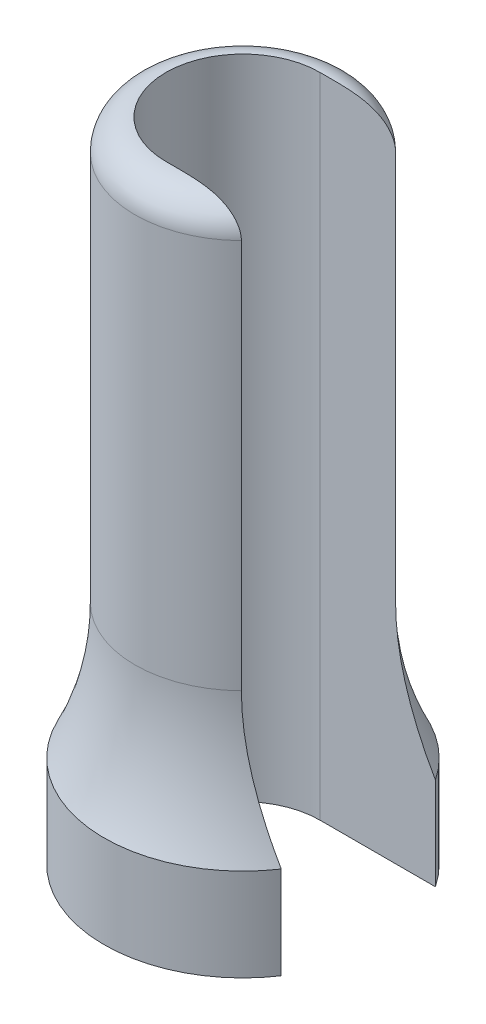
ISO-10303-21;
HEADER;
FILE_DESCRIPTION(('STEP AP214'),'2;1');
FILE_NAME('part.step','',(''),(''),'','','');
FILE_SCHEMA(('AUTOMOTIVE_DESIGN { 1 0 10303 214 1 1 1 1 }'));
ENDSEC;
DATA;
#1=APPLICATION_CONTEXT('core data for automotive mechanical design processes');
#2=APPLICATION_PROTOCOL_DEFINITION('international standard','automotive_design',2000,#1);
#3=PRODUCT_CONTEXT('',#1,'mechanical');
#4=PRODUCT('Part','Part','',(#3));
#5=PRODUCT_RELATED_PRODUCT_CATEGORY('part','',(#4));
#6=PRODUCT_DEFINITION_FORMATION('','',#4);
#7=PRODUCT_DEFINITION_CONTEXT('part definition',#1,'design');
#8=PRODUCT_DEFINITION('design','',#6,#7);
#9=PRODUCT_DEFINITION_SHAPE('','',#8);
#10=(LENGTH_UNIT() NAMED_UNIT(*) SI_UNIT(.MILLI.,.METRE.));
#11=(NAMED_UNIT(*) PLANE_ANGLE_UNIT() SI_UNIT($,.RADIAN.));
#12=(NAMED_UNIT(*) SI_UNIT($,.STERADIAN.) SOLID_ANGLE_UNIT());
#13=UNCERTAINTY_MEASURE_WITH_UNIT(LENGTH_MEASURE(1.E-05),#10,'distance_accuracy_value','');
#14=(GEOMETRIC_REPRESENTATION_CONTEXT(3) GLOBAL_UNCERTAINTY_ASSIGNED_CONTEXT((#13)) GLOBAL_UNIT_ASSIGNED_CONTEXT((#10,
#11,#12)) REPRESENTATION_CONTEXT('',''));
#15=CARTESIAN_POINT('',(0.,0.,0.));
#16=DIRECTION('',(0.,0.,1.));
#17=DIRECTION('',(1.,0.,0.));
#18=AXIS2_PLACEMENT_3D('',#15,#16,#17);
#19=CARTESIAN_POINT('',(0.,3.,0.));
#20=DIRECTION('',(0.,-1.,0.));
#21=DIRECTION('',(0.,0.,-1.));
#22=AXIS2_PLACEMENT_3D('',#19,#20,#21);
#23=CYLINDRICAL_SURFACE('',#22,4.5);
#24=CARTESIAN_POINT('',(0.,3.,0.));
#25=DIRECTION('',(0.,1.,0.));
#26=DIRECTION('',(0.,0.,1.));
#27=AXIS2_PLACEMENT_3D('',#24,#25,#26);
#28=CIRCLE('',#27,4.5);
#29=CARTESIAN_POINT('',(3.74165738677394,3.,-2.5));
#30=VERTEX_POINT('',#29);
#31=CARTESIAN_POINT('',(3.74165738677394,3.,2.5));
#32=VERTEX_POINT('',#31);
#33=EDGE_CURVE('E114',#30,#32,#28,.T.);
#34=ORIENTED_EDGE('',*,*,#33,.F.);
#35=DIRECTION('',(0.,1.,0.));
#36=VECTOR('',#35,1.);
#37=CARTESIAN_POINT('',(3.74165738677394,-16.5,-2.5));
#38=LINE('',#37,#36);
#39=CARTESIAN_POINT('',(3.74165738677394,0.,-2.5));
#40=VERTEX_POINT('',#39);
#41=EDGE_CURVE('E119',#40,#30,#38,.T.);
#42=ORIENTED_EDGE('',*,*,#41,.F.);
#43=CARTESIAN_POINT('',(0.,0.,0.));
#44=DIRECTION('',(0.,1.,0.));
#45=DIRECTION('',(0.,0.,1.));
#46=AXIS2_PLACEMENT_3D('',#43,#44,#45);
#47=CIRCLE('',#46,4.5);
#48=CARTESIAN_POINT('',(3.74165738677394,0.,2.5));
#49=VERTEX_POINT('',#48);
#50=EDGE_CURVE('E117',#40,#49,#47,.T.);
#51=ORIENTED_EDGE('',*,*,#50,.T.);
#52=DIRECTION('',(0.,1.,0.));
#53=VECTOR('',#52,1.);
#54=CARTESIAN_POINT('',(3.74165738677394,-16.5,2.5));
#55=LINE('',#54,#53);
#56=EDGE_CURVE('E100',#49,#32,#55,.T.);
#57=ORIENTED_EDGE('',*,*,#56,.T.);
#58=EDGE_LOOP('',(#34,#42,#51,#57));
#59=FACE_BOUND('',#58,.T.);
#60=ADVANCED_FACE('F39',(#59),#23,.T.);
#61=CARTESIAN_POINT('',(0.,0.,0.));
#62=DIRECTION('',(0.,1.,0.));
#63=DIRECTION('',(0.,0.,1.));
#64=AXIS2_PLACEMENT_3D('',#61,#62,#63);
#65=PLANE('',#64);
#66=ORIENTED_EDGE('',*,*,#50,.F.);
#67=DIRECTION('',(-1.,0.,0.));
#68=VECTOR('',#67,1.);
#69=CARTESIAN_POINT('',(0.,0.,-2.5));
#70=LINE('',#69,#68);
#71=CARTESIAN_POINT('',(0.,0.,-2.5));
#72=VERTEX_POINT('',#71);
#73=EDGE_CURVE('E192',#40,#72,#70,.T.);
#74=ORIENTED_EDGE('',*,*,#73,.T.);
#75=CARTESIAN_POINT('',(0.,0.,0.));
#76=DIRECTION('',(0.,1.,0.));
#77=DIRECTION('',(0.,0.,1.));
#78=AXIS2_PLACEMENT_3D('',#75,#76,#77);
#79=CIRCLE('',#78,2.5);
#80=CARTESIAN_POINT('',(0.,0.,2.5));
#81=VERTEX_POINT('',#80);
#82=EDGE_CURVE('E127',#72,#81,#79,.T.);
#83=ORIENTED_EDGE('',*,*,#82,.T.);
#84=DIRECTION('',(1.,0.,0.));
#85=VECTOR('',#84,1.);
#86=CARTESIAN_POINT('',(0.,0.,2.5));
#87=LINE('',#86,#85);
#88=EDGE_CURVE('E174',#81,#49,#87,.T.);
#89=ORIENTED_EDGE('',*,*,#88,.T.);
#90=EDGE_LOOP('',(#66,#74,#83,#89));
#91=FACE_BOUND('',#90,.T.);
#92=ADVANCED_FACE('F150',(#91),#65,.F.);
#93=CARTESIAN_POINT('',(0.,21.,0.));
#94=DIRECTION('',(0.,-1.,0.));
#95=DIRECTION('',(0.,0.,-1.));
#96=AXIS2_PLACEMENT_3D('',#93,#94,#95);
#97=CYLINDRICAL_SURFACE('',#96,3.5);
#98=DIRECTION('',(0.,1.,0.));
#99=VECTOR('',#98,1.);
#100=CARTESIAN_POINT('',(2.44948974278318,-1.50000000000001,2.5));
#101=LINE('',#100,#99);
#102=CARTESIAN_POINT('',(2.44948974278318,7.35889894354067,2.5));
#103=VERTEX_POINT('',#102);
#104=CARTESIAN_POINT('',(2.44948974278318,20.,2.5));
#105=VERTEX_POINT('',#104);
#106=EDGE_CURVE('E102',#103,#105,#101,.T.);
#107=ORIENTED_EDGE('',*,*,#106,.T.);
#108=CARTESIAN_POINT('',(0.,20.,0.));
#109=DIRECTION('',(0.,1.,0.));
#110=DIRECTION('',(0.,0.,1.));
#111=AXIS2_PLACEMENT_3D('',#108,#109,#110);
#112=CIRCLE('',#111,3.5);
#113=CARTESIAN_POINT('',(2.44948974278318,20.,-2.5));
#114=VERTEX_POINT('',#113);
#115=EDGE_CURVE('E54',#105,#114,#112,.F.);
#116=ORIENTED_EDGE('',*,*,#115,.T.);
#117=DIRECTION('',(0.,1.,0.));
#118=VECTOR('',#117,1.);
#119=CARTESIAN_POINT('',(2.44948974278318,-1.50000000000001,-2.5));
#120=LINE('',#119,#118);
#121=CARTESIAN_POINT('',(2.44948974278318,7.35889894354067,-2.5));
#122=VERTEX_POINT('',#121);
#123=EDGE_CURVE('E175',#122,#114,#120,.T.);
#124=ORIENTED_EDGE('',*,*,#123,.F.);
#125=CARTESIAN_POINT('',(0.,7.35889894354067,0.));
#126=DIRECTION('',(0.,-1.,0.));
#127=DIRECTION('',(0.,0.,-1.));
#128=AXIS2_PLACEMENT_3D('',#125,#126,#127);
#129=CIRCLE('',#128,3.5);
#130=EDGE_CURVE('E109',#122,#103,#129,.F.);
#131=ORIENTED_EDGE('',*,*,#130,.T.);
#132=EDGE_LOOP('',(#107,#116,#124,#131));
#133=FACE_BOUND('',#132,.T.);
#134=ADVANCED_FACE('F153',(#133),#97,.T.);
#135=CARTESIAN_POINT('',(0.,-1.50000000000001,0.));
#136=DIRECTION('',(0.,1.,0.));
#137=DIRECTION('',(0.,0.,1.));
#138=AXIS2_PLACEMENT_3D('',#135,#136,#137);
#139=CYLINDRICAL_SURFACE('',#138,2.5);
#140=DIRECTION('',(0.,1.,0.));
#141=VECTOR('',#140,1.);
#142=CARTESIAN_POINT('',(0.,-1.50000000000001,-2.5));
#143=LINE('',#142,#141);
#144=CARTESIAN_POINT('',(0.,21.,-2.5));
#145=VERTEX_POINT('',#144);
#146=EDGE_CURVE('E167',#72,#145,#143,.T.);
#147=ORIENTED_EDGE('',*,*,#146,.T.);
#148=CARTESIAN_POINT('',(0.,21.,0.));
#149=DIRECTION('',(0.,1.,0.));
#150=DIRECTION('',(0.,0.,1.));
#151=AXIS2_PLACEMENT_3D('',#148,#149,#150);
#152=CIRCLE('',#151,2.5);
#153=CARTESIAN_POINT('',(0.,21.,2.5));
#154=VERTEX_POINT('',#153);
#155=EDGE_CURVE('E170',#145,#154,#152,.T.);
#156=ORIENTED_EDGE('',*,*,#155,.T.);
#157=DIRECTION('',(0.,1.,0.));
#158=VECTOR('',#157,1.);
#159=CARTESIAN_POINT('',(0.,-1.50000000000001,2.5));
#160=LINE('',#159,#158);
#161=EDGE_CURVE('E180',#81,#154,#160,.T.);
#162=ORIENTED_EDGE('',*,*,#161,.F.);
#163=ORIENTED_EDGE('',*,*,#82,.F.);
#164=EDGE_LOOP('',(#147,#156,#162,#163));
#165=FACE_BOUND('',#164,.T.);
#166=ADVANCED_FACE('F156',(#165),#139,.F.);
#167=CARTESIAN_POINT('',(0.,-1.50000000000001,-2.5));
#168=DIRECTION('',(0.,0.,-1.));
#169=DIRECTION('',(-1.,0.,0.));
#170=AXIS2_PLACEMENT_3D('',#167,#168,#169);
#171=PLANE('',#170);
#172=ORIENTED_EDGE('',*,*,#123,.T.);
#173=CARTESIAN_POINT('',(2.44948974278318,20.,-2.5));
#174=CARTESIAN_POINT('',(2.44949248220905,20.0216892090072,-2.5));
#175=CARTESIAN_POINT('',(2.44848062898522,20.0433657922529,-2.5));
#176=CARTESIAN_POINT('',(2.44446408122315,20.0865215234319,-2.5));
#177=CARTESIAN_POINT('',(2.44146050999331,20.1080007757388,-2.5));
#178=CARTESIAN_POINT('',(2.4295775054387,20.1715864977788,-2.5));
#179=CARTESIAN_POINT('',(2.41782445998479,20.2131865400516,-2.5));
#180=CARTESIAN_POINT('',(2.38741443940528,20.2936312345789,-2.5));
#181=CARTESIAN_POINT('',(2.36877072236197,20.3324810085905,-2.5));
#182=CARTESIAN_POINT('',(2.3255808614028,20.4068043605177,-2.5));
#183=CARTESIAN_POINT('',(2.30102359281093,20.4422713970876,-2.5));
#184=CARTESIAN_POINT('',(2.238148396902,20.5204762775056,-2.5));
#185=CARTESIAN_POINT('',(2.19796918228049,20.5617158299715,-2.5));
#186=CARTESIAN_POINT('',(2.11154476631741,20.637080233287,-2.5));
#187=CARTESIAN_POINT('',(2.06529762936119,20.6712028048487,-2.5));
#188=CARTESIAN_POINT('',(1.94635522099902,20.7469659610157,-2.5));
#189=CARTESIAN_POINT('',(1.87127331282506,20.7848539757935,-2.5));
#190=CARTESIAN_POINT('',(1.75481054414618,20.8328296390386,-2.5));
#191=CARTESIAN_POINT('',(1.71512781636491,20.8473989674292,-2.5));
#192=CARTESIAN_POINT('',(1.63488793644295,20.8738253634689,-2.5));
#193=CARTESIAN_POINT('',(1.59433139759656,20.8856842696942,-2.5));
#194=CARTESIAN_POINT('',(1.4886106483483,20.913284790026,-2.5));
#195=CARTESIAN_POINT('',(1.42297877023962,20.9272182471442,-2.5));
#196=CARTESIAN_POINT('',(1.29086874269065,20.950346411328,-2.5));
#197=CARTESIAN_POINT('',(1.22438993855515,20.9595371917485,-2.5));
#198=CARTESIAN_POINT('',(1.09069536449658,20.9743564103371,-2.5));
#199=CARTESIAN_POINT('',(1.0234775550118,20.9799655839456,-2.5));
#200=CARTESIAN_POINT('',(0.888873054272358,20.9885942149464,-2.5));
#201=CARTESIAN_POINT('',(0.821486326340664,20.9916130501582,-2.5));
#202=CARTESIAN_POINT('',(0.690879450820612,20.9958354524013,-2.5));
#203=CARTESIAN_POINT('',(0.627662180007096,20.9971407011724,-2.5));
#204=CARTESIAN_POINT('',(0.501214463629527,20.9988956667328,-2.5));
#205=CARTESIAN_POINT('',(0.437984017520537,20.999345334843,-2.5));
#206=CARTESIAN_POINT('',(0.312289549729282,20.999871109872,-2.5));
#207=CARTESIAN_POINT('',(0.249825536948873,20.9999516829164,-2.5));
#208=CARTESIAN_POINT('',(0.12490760218445,20.9999991580207,-2.5));
#209=CARTESIAN_POINT('',(0.0624536802197722,20.9999660786568,-2.5));
#210=CARTESIAN_POINT('',(0.,21.,-2.5));
#211=B_SPLINE_CURVE_WITH_KNOTS('',3,(#173,#174,#175,#176,#177,#178,#179,#180,#181,#182,#183,
#184,#185,#186,#187,#188,#189,#190,#191,#192,#193,#194,#195,#196,#197,#198,#199,#200,#201,#202,
#203,#204,#205,#206,#207,#208,#209,#210),.UNSPECIFIED.,.F.,.F.,(4,2,2,2,2,2,2,2,2,2,2,2,2,2,2,2,
2,2,4),(0.,0.0650198175242697,0.130002995695699,0.258948214055522,0.387646614477254,
0.516589042412453,0.688363165076143,0.860192216022674,1.11099436083612,1.23775318494091,
1.36442576710924,1.56546896980062,1.76667835792791,1.96896108125938,2.17129237784551,
2.36097518172549,2.55066877745369,2.73806087139581,2.92542233801781),.UNSPECIFIED.);
#212=EDGE_CURVE('E11',#114,#145,#211,.T.);
#213=ORIENTED_EDGE('',*,*,#212,.T.);
#214=ORIENTED_EDGE('',*,*,#146,.F.);
#215=ORIENTED_EDGE('',*,*,#73,.F.);
#216=ORIENTED_EDGE('',*,*,#41,.T.);
#217=CARTESIAN_POINT('',(3.74165738677394,3.,-2.5));
#218=CARTESIAN_POINT('',(3.67409081945806,3.11600842094314,-2.5));
#219=CARTESIAN_POINT('',(3.60858487038733,3.23320438563919,-2.5));
#220=CARTESIAN_POINT('',(3.48188582578499,3.46993050984259,-2.5));
#221=CARTESIAN_POINT('',(3.42069349512446,3.58946107853668,-2.5));
#222=CARTESIAN_POINT('',(3.2436022260586,3.9520598094635,-2.5));
#223=CARTESIAN_POINT('',(3.1345433148397,4.1985298049304,-2.5));
#224=CARTESIAN_POINT('',(2.93964022013411,4.693207543722,-2.5));
#225=CARTESIAN_POINT('',(2.85327255607604,4.94120873915645,-2.5));
#226=CARTESIAN_POINT('',(2.70327086306637,5.44378411400527,-2.5));
#227=CARTESIAN_POINT('',(2.63960586070174,5.69834882604118,-2.5));
#228=CARTESIAN_POINT('',(2.56631487829308,6.07025711799183,-2.5));
#229=CARTESIAN_POINT('',(2.54627788202374,6.18560732485113,-2.5));
#230=CARTESIAN_POINT('',(2.51165728848184,6.4171236996476,-2.5));
#231=CARTESIAN_POINT('',(2.49707316415855,6.53328978761897,-2.5));
#232=CARTESIAN_POINT('',(2.47345563216244,6.76752248036587,-2.5));
#233=CARTESIAN_POINT('',(2.46448731463711,6.8855956646666,-2.5));
#234=CARTESIAN_POINT('',(2.45249469869331,7.1220766102168,-2.5));
#235=CARTESIAN_POINT('',(2.44947211161083,7.24048445797337,-2.5));
#236=CARTESIAN_POINT('',(2.44948974278319,7.35889894354067,-2.5));
#237=B_SPLINE_CURVE_WITH_KNOTS('',3,(#217,#218,#219,#220,#221,#222,#223,#224,#225,#226,#227,
#228,#229,#230,#231,#232,#233,#234,#235,#236),.UNSPECIFIED.,.F.,.F.,(4,2,2,2,2,2,2,2,2,4),(0.,
0.402705509808484,0.805482246831929,1.61313442705361,2.40008063607057,3.18594906331601,
3.53707723446336,3.88817145831942,4.2432631805694,4.5984570925145),.UNSPECIFIED.);
#238=EDGE_CURVE('E108',#30,#122,#237,.T.);
#239=ORIENTED_EDGE('',*,*,#238,.T.);
#240=EDGE_LOOP('',(#172,#213,#214,#215,#216,#239));
#241=FACE_BOUND('',#240,.T.);
#242=ADVANCED_FACE('F158',(#241),#171,.F.);
#243=CARTESIAN_POINT('',(0.,-1.50000000000001,2.5));
#244=DIRECTION('',(0.,0.,1.));
#245=DIRECTION('',(1.,0.,0.));
#246=AXIS2_PLACEMENT_3D('',#243,#244,#245);
#247=PLANE('',#246);
#248=ORIENTED_EDGE('',*,*,#161,.T.);
#249=CARTESIAN_POINT('',(0.,21.,2.5));
#250=CARTESIAN_POINT('',(0.0521330929069775,20.9999835367964,2.5));
#251=CARTESIAN_POINT('',(0.104266184271241,20.9999996393843,2.5));
#252=CARTESIAN_POINT('',(0.208535306013963,20.9999764734434,2.5));
#253=CARTESIAN_POINT('',(0.260671336390504,20.9999372017574,2.5));
#254=CARTESIAN_POINT('',(0.365144113196162,20.9996822690204,2.5));
#255=CARTESIAN_POINT('',(0.417480859377582,20.9994659292612,2.5));
#256=CARTESIAN_POINT('',(0.522150039780429,20.9986180154494,2.5));
#257=CARTESIAN_POINT('',(0.574482474067333,20.9979864497341,2.5));
#258=CARTESIAN_POINT('',(0.733338421109875,20.9949967208989,2.5));
#259=CARTESIAN_POINT('',(0.839846761536837,20.9915277451177,2.5));
#260=CARTESIAN_POINT('',(1.05238428897532,20.9783023988987,2.5));
#261=CARTESIAN_POINT('',(1.15841400137341,20.9685579442876,2.5));
#262=CARTESIAN_POINT('',(1.29999704033801,20.9483744360165,2.5));
#263=CARTESIAN_POINT('',(1.33620483485256,20.9425745324175,2.5));
#264=CARTESIAN_POINT('',(1.40836258634088,20.9295232136219,2.5));
#265=CARTESIAN_POINT('',(1.44431249638564,20.9222715408463,2.5));
#266=CARTESIAN_POINT('',(1.55150421720053,20.8980632081361,2.5));
#267=CARTESIAN_POINT('',(1.62222309808096,20.8786355632023,2.5));
#268=CARTESIAN_POINT('',(1.76162106150488,20.8312669912268,2.5));
#269=CARTESIAN_POINT('',(1.83027230857699,20.803242016256,2.5));
#270=CARTESIAN_POINT('',(1.96254949905858,20.7370075168595,2.5));
#271=CARTESIAN_POINT('',(2.02618316686525,20.6988140595612,2.5));
#272=CARTESIAN_POINT('',(2.12692292593058,20.6243457574792,2.5));
#273=CARTESIAN_POINT('',(2.1662057459586,20.5910293785925,2.5));
#274=CARTESIAN_POINT('',(2.23919109401747,20.5186765513192,2.5));
#275=CARTESIAN_POINT('',(2.27289421376143,20.4796407102959,2.5));
#276=CARTESIAN_POINT('',(2.33324025885503,20.3957022782932,2.5));
#277=CARTESIAN_POINT('',(2.35979892363659,20.3507382648771,2.5));
#278=CARTESIAN_POINT('',(2.40333945443153,20.2564192074598,2.5));
#279=CARTESIAN_POINT('',(2.42034692477148,20.2070763178443,2.5));
#280=CARTESIAN_POINT('',(2.43767653451683,20.1308863975793,2.5));
#281=CARTESIAN_POINT('',(2.44209094681293,20.1049220861027,2.5));
#282=CARTESIAN_POINT('',(2.44800171026533,20.052646217242,2.5));
#283=CARTESIAN_POINT('',(2.44949605967494,20.0263344340919,2.5));
#284=CARTESIAN_POINT('',(2.44948974278318,20.,2.5));
#285=B_SPLINE_CURVE_WITH_KNOTS('',3,(#249,#250,#251,#252,#253,#254,#255,#256,#257,#258,#259,
#260,#261,#262,#263,#264,#265,#266,#267,#268,#269,#270,#271,#272,#273,#274,#275,#276,#277,#278,
#279,#280,#281,#282,#283,#284),.UNSPECIFIED.,.F.,.F.,(4,2,2,2,2,2,2,2,2,2,2,2,2,2,2,2,2,4),(0.,
0.156399259273716,0.312807436498881,0.469817955168724,0.626825321366461,0.946460290502178,
1.265490121764,1.37547074023595,1.48547088923679,1.70506381656009,1.92687586535502,
2.14833948988548,2.30235315808563,2.45635048304864,2.6120914586792,2.76741291461382,
2.84627722258788,2.92519557428199),.UNSPECIFIED.);
#286=EDGE_CURVE('E68',#154,#105,#285,.T.);
#287=ORIENTED_EDGE('',*,*,#286,.T.);
#288=ORIENTED_EDGE('',*,*,#106,.F.);
#289=CARTESIAN_POINT('',(2.44948974278318,7.35889894354067,2.5));
#290=CARTESIAN_POINT('',(2.4494819357612,7.25397166223741,2.5));
#291=CARTESIAN_POINT('',(2.45185047904484,7.14905937468919,2.5));
#292=CARTESIAN_POINT('',(2.46126766225775,6.93945890181179,2.5));
#293=CARTESIAN_POINT('',(2.46831566471385,6.83477068790606,2.5));
#294=CARTESIAN_POINT('',(2.49634032827712,6.52163269619955,2.5));
#295=CARTESIAN_POINT('',(2.52419811819347,6.31376467321829,2.5));
#296=CARTESIAN_POINT('',(2.59629108255977,5.90475733172355,2.5));
#297=CARTESIAN_POINT('',(2.64022746595192,5.70356404480346,2.5));
#298=CARTESIAN_POINT('',(2.74290435050633,5.30495004966257,2.5));
#299=CARTESIAN_POINT('',(2.80164923655304,5.10753047752123,2.5));
#300=CARTESIAN_POINT('',(2.92229977300544,4.74713966490772,2.5));
#301=CARTESIAN_POINT('',(2.9823341166446,4.58353468451197,2.5));
#302=CARTESIAN_POINT('',(3.11102404585004,4.25977854705,2.5));
#303=CARTESIAN_POINT('',(3.17967865887585,4.09962700275097,2.5));
#304=CARTESIAN_POINT('',(3.32605282439827,3.78049968350072,2.5));
#305=CARTESIAN_POINT('',(3.40389723208919,3.62158135880887,2.5));
#306=CARTESIAN_POINT('',(3.56720092004523,3.30774751747131,2.5));
#307=CARTESIAN_POINT('',(3.65265851763729,3.15283112603137,2.5));
#308=CARTESIAN_POINT('',(3.74165738677394,3.,2.5));
#309=B_SPLINE_CURVE_WITH_KNOTS('',3,(#289,#290,#291,#292,#293,#294,#295,#296,#297,#298,#299,
#300,#301,#302,#303,#304,#305,#306,#307,#308),.UNSPECIFIED.,.F.,.F.,(4,2,2,2,2,2,2,2,2,4),(0.,
0.314726354892875,0.629409844050929,1.25774584599263,1.87495365018855,2.49234442835202,
3.01490841938062,3.53741350752239,4.06808099303171,4.59863147962348),.UNSPECIFIED.);
#310=EDGE_CURVE('E97',#103,#32,#309,.T.);
#311=ORIENTED_EDGE('',*,*,#310,.T.);
#312=ORIENTED_EDGE('',*,*,#56,.F.);
#313=ORIENTED_EDGE('',*,*,#88,.F.);
#314=EDGE_LOOP('',(#248,#287,#288,#311,#312,#313));
#315=FACE_BOUND('',#314,.T.);
#316=ADVANCED_FACE('F99',(#315),#247,.F.);
#317=CARTESIAN_POINT('',(0.,7.35889894354067,0.));
#318=DIRECTION('',(0.,-1.,0.));
#319=DIRECTION('',(0.,0.,-1.));
#320=AXIS2_PLACEMENT_3D('',#317,#318,#319);
#321=TOROIDAL_SURFACE('',#320,13.5,10.);
#322=ORIENTED_EDGE('',*,*,#238,.F.);
#323=ORIENTED_EDGE('',*,*,#33,.T.);
#324=ORIENTED_EDGE('',*,*,#310,.F.);
#325=ORIENTED_EDGE('',*,*,#130,.F.);
#326=EDGE_LOOP('',(#322,#323,#324,#325));
#327=FACE_BOUND('',#326,.T.);
#328=ADVANCED_FACE('F121',(#327),#321,.F.);
#329=CARTESIAN_POINT('',(0.,20.,0.));
#330=DIRECTION('',(0.,1.,0.));
#331=DIRECTION('',(0.,0.,1.));
#332=AXIS2_PLACEMENT_3D('',#329,#330,#331);
#333=TOROIDAL_SURFACE('',#332,2.5,1.);
#334=ORIENTED_EDGE('',*,*,#212,.F.);
#335=ORIENTED_EDGE('',*,*,#115,.F.);
#336=ORIENTED_EDGE('',*,*,#286,.F.);
#337=ORIENTED_EDGE('',*,*,#155,.F.);
#338=EDGE_LOOP('',(#334,#335,#336,#337));
#339=FACE_BOUND('',#338,.T.);
#340=ADVANCED_FACE('F41',(#339),#333,.T.);
#341=CLOSED_SHELL('',(#60,#92,#134,#166,#242,#316,#328,#340));
#342=MANIFOLD_SOLID_BREP('B2',#341);
#343=ADVANCED_BREP_SHAPE_REPRESENTATION('',(#18,#342),#14);
#344=SHAPE_DEFINITION_REPRESENTATION(#9,#343);
ENDSEC;
END-ISO-10303-21;
